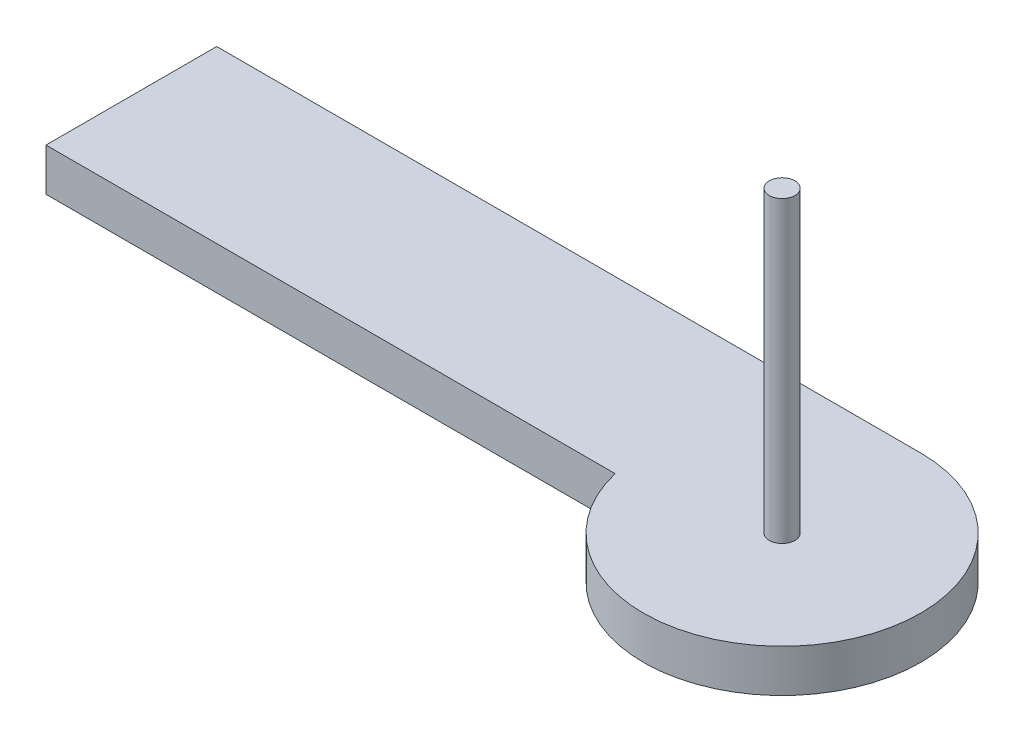
ISO-10303-21;
HEADER;
FILE_DESCRIPTION(('STEP AP214'),'2;1');
FILE_NAME('part.step','',(''),(''),'','','');
FILE_SCHEMA(('AUTOMOTIVE_DESIGN { 1 0 10303 214 1 1 1 1 }'));
ENDSEC;
DATA;
#1=APPLICATION_CONTEXT('core data for automotive mechanical design processes');
#2=APPLICATION_PROTOCOL_DEFINITION('international standard','automotive_design',2000,#1);
#3=PRODUCT_CONTEXT('',#1,'mechanical');
#4=PRODUCT('Part','Part','',(#3));
#5=PRODUCT_RELATED_PRODUCT_CATEGORY('part','',(#4));
#6=PRODUCT_DEFINITION_FORMATION('','',#4);
#7=PRODUCT_DEFINITION_CONTEXT('part definition',#1,'design');
#8=PRODUCT_DEFINITION('design','',#6,#7);
#9=PRODUCT_DEFINITION_SHAPE('','',#8);
#10=(LENGTH_UNIT() NAMED_UNIT(*) SI_UNIT(.MILLI.,.METRE.));
#11=(NAMED_UNIT(*) PLANE_ANGLE_UNIT() SI_UNIT($,.RADIAN.));
#12=(NAMED_UNIT(*) SI_UNIT($,.STERADIAN.) SOLID_ANGLE_UNIT());
#13=UNCERTAINTY_MEASURE_WITH_UNIT(LENGTH_MEASURE(1.E-05),#10,'distance_accuracy_value','');
#14=(GEOMETRIC_REPRESENTATION_CONTEXT(3) GLOBAL_UNCERTAINTY_ASSIGNED_CONTEXT((#13)) GLOBAL_UNIT_ASSIGNED_CONTEXT((#10,
#11,#12)) REPRESENTATION_CONTEXT('',''));
#15=CARTESIAN_POINT('',(0.,0.,0.));
#16=DIRECTION('',(0.,0.,1.));
#17=DIRECTION('',(1.,0.,0.));
#18=AXIS2_PLACEMENT_3D('',#15,#16,#17);
#19=CARTESIAN_POINT('',(0.,10.,7.50000000000002));
#20=DIRECTION('',(0.,0.,-1.));
#21=DIRECTION('',(-1.,0.,0.));
#22=AXIS2_PLACEMENT_3D('',#19,#20,#21);
#23=PLANE('',#22);
#24=DIRECTION('',(1.,0.,0.));
#25=VECTOR('',#24,1.);
#26=CARTESIAN_POINT('',(0.,0.,7.50000000000002));
#27=LINE('',#26,#25);
#28=CARTESIAN_POINT('',(-165.,0.,7.50000000000002));
#29=VERTEX_POINT('',#28);
#30=CARTESIAN_POINT('',(-31.6227766016838,0.,7.50000000000002));
#31=VERTEX_POINT('',#30);
#32=EDGE_CURVE('E96',#29,#31,#27,.T.);
#33=ORIENTED_EDGE('',*,*,#32,.T.);
#34=DIRECTION('',(0.,-1.,0.));
#35=VECTOR('',#34,1.);
#36=CARTESIAN_POINT('',(-31.6227766016838,10.,7.50000000000002));
#37=LINE('',#36,#35);
#38=CARTESIAN_POINT('',(-31.6227766016838,10.,7.50000000000002));
#39=VERTEX_POINT('',#38);
#40=EDGE_CURVE('E11',#39,#31,#37,.T.);
#41=ORIENTED_EDGE('',*,*,#40,.F.);
#42=DIRECTION('',(1.,0.,0.));
#43=VECTOR('',#42,1.);
#44=CARTESIAN_POINT('',(0.,10.,7.50000000000002));
#45=LINE('',#44,#43);
#46=CARTESIAN_POINT('',(-165.,10.,7.50000000000002));
#47=VERTEX_POINT('',#46);
#48=EDGE_CURVE('E84',#47,#39,#45,.T.);
#49=ORIENTED_EDGE('',*,*,#48,.F.);
#50=DIRECTION('',(0.,-1.,0.));
#51=VECTOR('',#50,1.);
#52=CARTESIAN_POINT('',(-165.,10.,7.50000000000002));
#53=LINE('',#52,#51);
#54=EDGE_CURVE('E92',#47,#29,#53,.T.);
#55=ORIENTED_EDGE('',*,*,#54,.T.);
#56=EDGE_LOOP('',(#33,#41,#49,#55));
#57=FACE_BOUND('',#56,.T.);
#58=ADVANCED_FACE('F33',(#57),#23,.F.);
#59=CARTESIAN_POINT('',(0.,10.,0.));
#60=DIRECTION('',(0.,-1.,0.));
#61=DIRECTION('',(0.,0.,-1.));
#62=AXIS2_PLACEMENT_3D('',#59,#60,#61);
#63=CYLINDRICAL_SURFACE('',#62,32.5);
#64=CARTESIAN_POINT('',(0.,0.,0.));
#65=DIRECTION('',(0.,1.,0.));
#66=DIRECTION('',(0.,0.,1.));
#67=AXIS2_PLACEMENT_3D('',#64,#65,#66);
#68=CIRCLE('',#67,32.5);
#69=CARTESIAN_POINT('',(0.,0.,-32.5));
#70=VERTEX_POINT('',#69);
#71=EDGE_CURVE('E88',#31,#70,#68,.T.);
#72=ORIENTED_EDGE('',*,*,#71,.T.);
#73=DIRECTION('',(0.,-1.,0.));
#74=VECTOR('',#73,1.);
#75=CARTESIAN_POINT('',(0.,10.,-32.5));
#76=LINE('',#75,#74);
#77=CARTESIAN_POINT('',(0.,10.,-32.5));
#78=VERTEX_POINT('',#77);
#79=EDGE_CURVE('E41',#78,#70,#76,.T.);
#80=ORIENTED_EDGE('',*,*,#79,.F.);
#81=CARTESIAN_POINT('',(0.,10.,0.));
#82=DIRECTION('',(0.,1.,0.));
#83=DIRECTION('',(0.,0.,1.));
#84=AXIS2_PLACEMENT_3D('',#81,#82,#83);
#85=CIRCLE('',#84,32.5);
#86=EDGE_CURVE('E79',#39,#78,#85,.T.);
#87=ORIENTED_EDGE('',*,*,#86,.F.);
#88=ORIENTED_EDGE('',*,*,#40,.T.);
#89=EDGE_LOOP('',(#72,#80,#87,#88));
#90=FACE_BOUND('',#89,.T.);
#91=ADVANCED_FACE('F87',(#90),#63,.T.);
#92=CARTESIAN_POINT('',(0.,10.,-32.5));
#93=DIRECTION('',(0.,0.,1.));
#94=DIRECTION('',(1.,0.,0.));
#95=AXIS2_PLACEMENT_3D('',#92,#93,#94);
#96=PLANE('',#95);
#97=DIRECTION('',(-1.,0.,0.));
#98=VECTOR('',#97,1.);
#99=CARTESIAN_POINT('',(0.,0.,-32.5));
#100=LINE('',#99,#98);
#101=CARTESIAN_POINT('',(-165.,0.,-32.5));
#102=VERTEX_POINT('',#101);
#103=EDGE_CURVE('E66',#70,#102,#100,.T.);
#104=ORIENTED_EDGE('',*,*,#103,.T.);
#105=DIRECTION('',(0.,-1.,0.));
#106=VECTOR('',#105,1.);
#107=CARTESIAN_POINT('',(-165.,10.,-32.5));
#108=LINE('',#107,#106);
#109=CARTESIAN_POINT('',(-165.,10.,-32.5));
#110=VERTEX_POINT('',#109);
#111=EDGE_CURVE('E89',#110,#102,#108,.T.);
#112=ORIENTED_EDGE('',*,*,#111,.F.);
#113=DIRECTION('',(-1.,0.,0.));
#114=VECTOR('',#113,1.);
#115=CARTESIAN_POINT('',(0.,10.,-32.5));
#116=LINE('',#115,#114);
#117=EDGE_CURVE('E82',#78,#110,#116,.T.);
#118=ORIENTED_EDGE('',*,*,#117,.F.);
#119=ORIENTED_EDGE('',*,*,#79,.T.);
#120=EDGE_LOOP('',(#104,#112,#118,#119));
#121=FACE_BOUND('',#120,.T.);
#122=ADVANCED_FACE('F90',(#121),#96,.F.);
#123=CARTESIAN_POINT('',(-165.,10.,0.));
#124=DIRECTION('',(1.,0.,0.));
#125=DIRECTION('',(0.,0.,-1.));
#126=AXIS2_PLACEMENT_3D('',#123,#124,#125);
#127=PLANE('',#126);
#128=DIRECTION('',(0.,0.,1.));
#129=VECTOR('',#128,1.);
#130=CARTESIAN_POINT('',(-165.,0.,0.));
#131=LINE('',#130,#129);
#132=EDGE_CURVE('E72',#102,#29,#131,.T.);
#133=ORIENTED_EDGE('',*,*,#132,.T.);
#134=ORIENTED_EDGE('',*,*,#54,.F.);
#135=DIRECTION('',(0.,0.,1.));
#136=VECTOR('',#135,1.);
#137=CARTESIAN_POINT('',(-165.,10.,0.));
#138=LINE('',#137,#136);
#139=EDGE_CURVE('E49',#110,#47,#138,.T.);
#140=ORIENTED_EDGE('',*,*,#139,.F.);
#141=ORIENTED_EDGE('',*,*,#111,.T.);
#142=EDGE_LOOP('',(#133,#134,#140,#141));
#143=FACE_BOUND('',#142,.T.);
#144=ADVANCED_FACE('F104',(#143),#127,.F.);
#145=CARTESIAN_POINT('',(0.,10.,0.));
#146=DIRECTION('',(0.,1.,0.));
#147=DIRECTION('',(0.,0.,1.));
#148=AXIS2_PLACEMENT_3D('',#145,#146,#147);
#149=PLANE('',#148);
#150=CARTESIAN_POINT('',(0.,10.,0.));
#151=DIRECTION('',(0.,1.,0.));
#152=DIRECTION('',(0.,0.,1.));
#153=AXIS2_PLACEMENT_3D('',#150,#151,#152);
#154=CIRCLE('',#153,3.);
#155=CARTESIAN_POINT('',(0.,10.,3.));
#156=VERTEX_POINT('',#155);
#157=EDGE_CURVE('E110',#156,#156,#154,.T.);
#158=ORIENTED_EDGE('',*,*,#157,.F.);
#159=EDGE_LOOP('',(#158));
#160=FACE_BOUND('',#159,.T.);
#161=ORIENTED_EDGE('',*,*,#48,.T.);
#162=ORIENTED_EDGE('',*,*,#86,.T.);
#163=ORIENTED_EDGE('',*,*,#117,.T.);
#164=ORIENTED_EDGE('',*,*,#139,.T.);
#165=EDGE_LOOP('',(#161,#162,#163,#164));
#166=FACE_BOUND('',#165,.T.);
#167=ADVANCED_FACE('F80',(#160,#166),#149,.T.);
#168=CARTESIAN_POINT('',(0.,0.,0.));
#169=DIRECTION('',(0.,1.,0.));
#170=DIRECTION('',(0.,0.,1.));
#171=AXIS2_PLACEMENT_3D('',#168,#169,#170);
#172=PLANE('',#171);
#173=ORIENTED_EDGE('',*,*,#32,.F.);
#174=ORIENTED_EDGE('',*,*,#132,.F.);
#175=ORIENTED_EDGE('',*,*,#103,.F.);
#176=ORIENTED_EDGE('',*,*,#71,.F.);
#177=EDGE_LOOP('',(#173,#174,#175,#176));
#178=FACE_BOUND('',#177,.T.);
#179=ADVANCED_FACE('F107',(#178),#172,.F.);
#180=CARTESIAN_POINT('',(0.,80.,0.));
#181=DIRECTION('',(0.,-1.,0.));
#182=DIRECTION('',(0.,0.,-1.));
#183=AXIS2_PLACEMENT_3D('',#180,#181,#182);
#184=CYLINDRICAL_SURFACE('',#183,3.);
#185=CARTESIAN_POINT('',(0.,80.,0.));
#186=DIRECTION('',(0.,1.,0.));
#187=DIRECTION('',(0.,0.,1.));
#188=AXIS2_PLACEMENT_3D('',#185,#186,#187);
#189=CIRCLE('',#188,3.);
#190=CARTESIAN_POINT('',(0.,80.,3.));
#191=VERTEX_POINT('',#190);
#192=EDGE_CURVE('E99',#191,#191,#189,.T.);
#193=ORIENTED_EDGE('',*,*,#192,.F.);
#194=EDGE_LOOP('',(#193));
#195=FACE_BOUND('',#194,.T.);
#196=ORIENTED_EDGE('',*,*,#157,.T.);
#197=EDGE_LOOP('',(#196));
#198=FACE_BOUND('',#197,.T.);
#199=ADVANCED_FACE('F118',(#195,#198),#184,.T.);
#200=CARTESIAN_POINT('',(0.,80.,0.));
#201=DIRECTION('',(0.,1.,0.));
#202=DIRECTION('',(0.,0.,1.));
#203=AXIS2_PLACEMENT_3D('',#200,#201,#202);
#204=PLANE('',#203);
#205=ORIENTED_EDGE('',*,*,#192,.T.);
#206=EDGE_LOOP('',(#205));
#207=FACE_BOUND('',#206,.T.);
#208=ADVANCED_FACE('F116',(#207),#204,.T.);
#209=CLOSED_SHELL('',(#58,#91,#122,#144,#167,#179,#199,#208));
#210=MANIFOLD_SOLID_BREP('B2',#209);
#211=ADVANCED_BREP_SHAPE_REPRESENTATION('',(#18,#210),#14);
#212=SHAPE_DEFINITION_REPRESENTATION(#9,#211);
ENDSEC;
END-ISO-10303-21;
